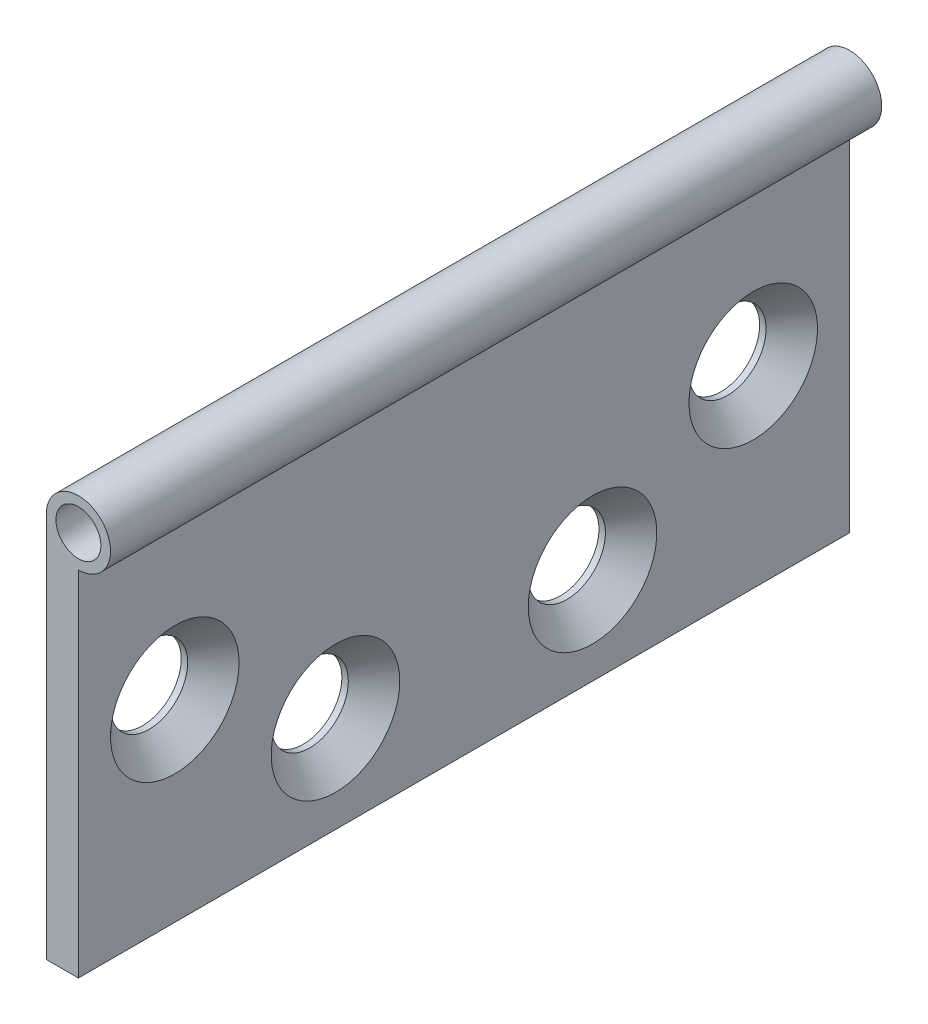
ISO-10303-21;
HEADER;
FILE_DESCRIPTION(('STEP AP214'),'2;1');
FILE_NAME('part.step','',(''),(''),'','','');
FILE_SCHEMA(('AUTOMOTIVE_DESIGN { 1 0 10303 214 1 1 1 1 }'));
ENDSEC;
DATA;
#1=APPLICATION_CONTEXT('core data for automotive mechanical design processes');
#2=APPLICATION_PROTOCOL_DEFINITION('international standard','automotive_design',2000,#1);
#3=PRODUCT_CONTEXT('',#1,'mechanical');
#4=PRODUCT('Part','Part','',(#3));
#5=PRODUCT_RELATED_PRODUCT_CATEGORY('part','',(#4));
#6=PRODUCT_DEFINITION_FORMATION('','',#4);
#7=PRODUCT_DEFINITION_CONTEXT('part definition',#1,'design');
#8=PRODUCT_DEFINITION('design','',#6,#7);
#9=PRODUCT_DEFINITION_SHAPE('','',#8);
#10=(LENGTH_UNIT() NAMED_UNIT(*) SI_UNIT(.MILLI.,.METRE.));
#11=(NAMED_UNIT(*) PLANE_ANGLE_UNIT() SI_UNIT($,.RADIAN.));
#12=(NAMED_UNIT(*) SI_UNIT($,.STERADIAN.) SOLID_ANGLE_UNIT());
#13=UNCERTAINTY_MEASURE_WITH_UNIT(LENGTH_MEASURE(1.E-05),#10,'distance_accuracy_value','');
#14=(GEOMETRIC_REPRESENTATION_CONTEXT(3) GLOBAL_UNCERTAINTY_ASSIGNED_CONTEXT((#13)) GLOBAL_UNIT_ASSIGNED_CONTEXT((#10,
#11,#12)) REPRESENTATION_CONTEXT('',''));
#15=CARTESIAN_POINT('',(0.,0.,0.));
#16=DIRECTION('',(0.,0.,1.));
#17=DIRECTION('',(1.,0.,0.));
#18=AXIS2_PLACEMENT_3D('',#15,#16,#17);
#19=CARTESIAN_POINT('',(5.,0.,60.));
#20=DIRECTION('',(-1.,0.,0.));
#21=DIRECTION('',(0.,0.,1.));
#22=AXIS2_PLACEMENT_3D('',#19,#20,#21);
#23=PLANE('',#22);
#24=CARTESIAN_POINT('',(5.,15.,-20.));
#25=DIRECTION('',(-1.,0.,0.));
#26=DIRECTION('',(0.,0.,1.));
#27=AXIS2_PLACEMENT_3D('',#24,#25,#26);
#28=CIRCLE('',#27,10.);
#29=CARTESIAN_POINT('',(5.,15.,-9.99999999999999));
#30=VERTEX_POINT('',#29);
#31=EDGE_CURVE('E138',#30,#30,#28,.T.);
#32=ORIENTED_EDGE('',*,*,#31,.T.);
#33=EDGE_LOOP('',(#32));
#34=FACE_BOUND('',#33,.T.);
#35=CARTESIAN_POINT('',(5.,30.,-45.));
#36=DIRECTION('',(-1.,0.,0.));
#37=DIRECTION('',(0.,0.,1.));
#38=AXIS2_PLACEMENT_3D('',#35,#36,#37);
#39=CIRCLE('',#38,10.);
#40=CARTESIAN_POINT('',(5.,30.,-35.));
#41=VERTEX_POINT('',#40);
#42=EDGE_CURVE('E142',#41,#41,#39,.T.);
#43=ORIENTED_EDGE('',*,*,#42,.T.);
#44=EDGE_LOOP('',(#43));
#45=FACE_BOUND('',#44,.T.);
#46=CARTESIAN_POINT('',(5.,30.,45.));
#47=DIRECTION('',(1.,0.,0.));
#48=DIRECTION('',(0.,0.,-1.));
#49=AXIS2_PLACEMENT_3D('',#46,#47,#48);
#50=CIRCLE('',#49,10.);
#51=CARTESIAN_POINT('',(5.,30.,35.));
#52=VERTEX_POINT('',#51);
#53=EDGE_CURVE('E146',#52,#52,#50,.T.);
#54=ORIENTED_EDGE('',*,*,#53,.F.);
#55=EDGE_LOOP('',(#54));
#56=FACE_BOUND('',#55,.T.);
#57=CARTESIAN_POINT('',(5.,15.,20.));
#58=DIRECTION('',(1.,0.,0.));
#59=DIRECTION('',(0.,0.,-1.));
#60=AXIS2_PLACEMENT_3D('',#57,#58,#59);
#61=CIRCLE('',#60,10.);
#62=CARTESIAN_POINT('',(5.,15.,9.99999999999999));
#63=VERTEX_POINT('',#62);
#64=EDGE_CURVE('E149',#63,#63,#61,.T.);
#65=ORIENTED_EDGE('',*,*,#64,.F.);
#66=EDGE_LOOP('',(#65));
#67=FACE_BOUND('',#66,.T.);
#68=DIRECTION('',(0.,0.,-1.));
#69=VECTOR('',#68,1.);
#70=CARTESIAN_POINT('',(5.,55.,60.));
#71=LINE('',#70,#69);
#72=CARTESIAN_POINT('',(5.,55.,60.));
#73=VERTEX_POINT('',#72);
#74=CARTESIAN_POINT('',(5.,55.,-60.));
#75=VERTEX_POINT('',#74);
#76=EDGE_CURVE('E62',#73,#75,#71,.T.);
#77=ORIENTED_EDGE('',*,*,#76,.F.);
#78=DIRECTION('',(0.,1.,0.));
#79=VECTOR('',#78,1.);
#80=CARTESIAN_POINT('',(5.,0.,60.));
#81=LINE('',#80,#79);
#82=CARTESIAN_POINT('',(5.,0.,60.));
#83=VERTEX_POINT('',#82);
#84=EDGE_CURVE('E117',#83,#73,#81,.T.);
#85=ORIENTED_EDGE('',*,*,#84,.F.);
#86=DIRECTION('',(0.,0.,-1.));
#87=VECTOR('',#86,1.);
#88=CARTESIAN_POINT('',(5.,0.,60.));
#89=LINE('',#88,#87);
#90=CARTESIAN_POINT('',(5.,0.,-60.));
#91=VERTEX_POINT('',#90);
#92=EDGE_CURVE('E71',#83,#91,#89,.T.);
#93=ORIENTED_EDGE('',*,*,#92,.T.);
#94=DIRECTION('',(0.,1.,0.));
#95=VECTOR('',#94,1.);
#96=CARTESIAN_POINT('',(5.,0.,-60.));
#97=LINE('',#96,#95);
#98=EDGE_CURVE('E112',#91,#75,#97,.T.);
#99=ORIENTED_EDGE('',*,*,#98,.T.);
#100=EDGE_LOOP('',(#77,#85,#93,#99));
#101=FACE_BOUND('',#100,.T.);
#102=ADVANCED_FACE('F48',(#34,#45,#56,#67,#101),#23,.F.);
#103=CARTESIAN_POINT('',(0.,0.,60.));
#104=DIRECTION('',(-1.,0.,0.));
#105=DIRECTION('',(0.,0.,1.));
#106=AXIS2_PLACEMENT_3D('',#103,#104,#105);
#107=PLANE('',#106);
#108=CARTESIAN_POINT('',(0.,15.,-20.));
#109=DIRECTION('',(-1.,0.,0.));
#110=DIRECTION('',(0.,0.,1.));
#111=AXIS2_PLACEMENT_3D('',#108,#109,#110);
#112=CIRCLE('',#111,6.);
#113=CARTESIAN_POINT('',(0.,15.,-14.));
#114=VERTEX_POINT('',#113);
#115=EDGE_CURVE('E229',#114,#114,#112,.T.);
#116=ORIENTED_EDGE('',*,*,#115,.F.);
#117=EDGE_LOOP('',(#116));
#118=FACE_BOUND('',#117,.T.);
#119=CARTESIAN_POINT('',(0.,30.,-45.));
#120=DIRECTION('',(-1.,0.,0.));
#121=DIRECTION('',(0.,0.,1.));
#122=AXIS2_PLACEMENT_3D('',#119,#120,#121);
#123=CIRCLE('',#122,6.);
#124=CARTESIAN_POINT('',(0.,30.,-39.));
#125=VERTEX_POINT('',#124);
#126=EDGE_CURVE('E236',#125,#125,#123,.T.);
#127=ORIENTED_EDGE('',*,*,#126,.F.);
#128=EDGE_LOOP('',(#127));
#129=FACE_BOUND('',#128,.T.);
#130=CARTESIAN_POINT('',(0.,30.,45.));
#131=DIRECTION('',(1.,0.,0.));
#132=DIRECTION('',(0.,0.,-1.));
#133=AXIS2_PLACEMENT_3D('',#130,#131,#132);
#134=CIRCLE('',#133,6.);
#135=CARTESIAN_POINT('',(0.,30.,39.));
#136=VERTEX_POINT('',#135);
#137=EDGE_CURVE('E152',#136,#136,#134,.T.);
#138=ORIENTED_EDGE('',*,*,#137,.T.);
#139=EDGE_LOOP('',(#138));
#140=FACE_BOUND('',#139,.T.);
#141=CARTESIAN_POINT('',(0.,15.,20.));
#142=DIRECTION('',(1.,0.,0.));
#143=DIRECTION('',(0.,0.,-1.));
#144=AXIS2_PLACEMENT_3D('',#141,#142,#143);
#145=CIRCLE('',#144,6.);
#146=CARTESIAN_POINT('',(0.,15.,14.));
#147=VERTEX_POINT('',#146);
#148=EDGE_CURVE('E155',#147,#147,#145,.T.);
#149=ORIENTED_EDGE('',*,*,#148,.T.);
#150=EDGE_LOOP('',(#149));
#151=FACE_BOUND('',#150,.T.);
#152=DIRECTION('',(0.,1.,0.));
#153=VECTOR('',#152,1.);
#154=CARTESIAN_POINT('',(0.,0.,-60.));
#155=LINE('',#154,#153);
#156=CARTESIAN_POINT('',(0.,0.,-60.));
#157=VERTEX_POINT('',#156);
#158=CARTESIAN_POINT('',(0.,60.,-60.));
#159=VERTEX_POINT('',#158);
#160=EDGE_CURVE('E111',#157,#159,#155,.T.);
#161=ORIENTED_EDGE('',*,*,#160,.F.);
#162=DIRECTION('',(0.,0.,-1.));
#163=VECTOR('',#162,1.);
#164=CARTESIAN_POINT('',(0.,0.,60.));
#165=LINE('',#164,#163);
#166=CARTESIAN_POINT('',(0.,0.,60.));
#167=VERTEX_POINT('',#166);
#168=EDGE_CURVE('E55',#167,#157,#165,.T.);
#169=ORIENTED_EDGE('',*,*,#168,.F.);
#170=DIRECTION('',(0.,1.,0.));
#171=VECTOR('',#170,1.);
#172=CARTESIAN_POINT('',(0.,0.,60.));
#173=LINE('',#172,#171);
#174=CARTESIAN_POINT('',(0.,60.,60.));
#175=VERTEX_POINT('',#174);
#176=EDGE_CURVE('E87',#167,#175,#173,.T.);
#177=ORIENTED_EDGE('',*,*,#176,.T.);
#178=DIRECTION('',(0.,0.,-1.));
#179=VECTOR('',#178,1.);
#180=CARTESIAN_POINT('',(0.,60.,60.));
#181=LINE('',#180,#179);
#182=EDGE_CURVE('E13',#175,#159,#181,.T.);
#183=ORIENTED_EDGE('',*,*,#182,.T.);
#184=EDGE_LOOP('',(#161,#169,#177,#183));
#185=FACE_BOUND('',#184,.T.);
#186=ADVANCED_FACE('F128',(#118,#129,#140,#151,#185),#107,.T.);
#187=CARTESIAN_POINT('',(5.,0.,60.));
#188=DIRECTION('',(0.,-1.,0.));
#189=DIRECTION('',(0.,0.,-1.));
#190=AXIS2_PLACEMENT_3D('',#187,#188,#189);
#191=PLANE('',#190);
#192=DIRECTION('',(-1.,0.,0.));
#193=VECTOR('',#192,1.);
#194=CARTESIAN_POINT('',(5.,0.,-60.));
#195=LINE('',#194,#193);
#196=EDGE_CURVE('E119',#91,#157,#195,.T.);
#197=ORIENTED_EDGE('',*,*,#196,.F.);
#198=ORIENTED_EDGE('',*,*,#92,.F.);
#199=DIRECTION('',(-1.,0.,0.));
#200=VECTOR('',#199,1.);
#201=CARTESIAN_POINT('',(5.,0.,60.));
#202=LINE('',#201,#200);
#203=EDGE_CURVE('E121',#83,#167,#202,.T.);
#204=ORIENTED_EDGE('',*,*,#203,.T.);
#205=ORIENTED_EDGE('',*,*,#168,.T.);
#206=EDGE_LOOP('',(#197,#198,#204,#205));
#207=FACE_BOUND('',#206,.T.);
#208=ADVANCED_FACE('F126',(#207),#191,.T.);
#209=CARTESIAN_POINT('',(0.,0.,60.));
#210=DIRECTION('',(0.,0.,-1.));
#211=DIRECTION('',(-1.,0.,0.));
#212=AXIS2_PLACEMENT_3D('',#209,#210,#211);
#213=PLANE('',#212);
#214=CARTESIAN_POINT('',(5.,60.,60.));
#215=DIRECTION('',(0.,0.,1.));
#216=DIRECTION('',(1.,0.,0.));
#217=AXIS2_PLACEMENT_3D('',#214,#215,#216);
#218=CIRCLE('',#217,3.5);
#219=CARTESIAN_POINT('',(8.5,60.,60.));
#220=VERTEX_POINT('',#219);
#221=EDGE_CURVE('E164',#220,#220,#218,.T.);
#222=ORIENTED_EDGE('',*,*,#221,.F.);
#223=EDGE_LOOP('',(#222));
#224=FACE_BOUND('',#223,.T.);
#225=ORIENTED_EDGE('',*,*,#84,.T.);
#226=CARTESIAN_POINT('',(5.,60.,60.));
#227=DIRECTION('',(0.,0.,1.));
#228=DIRECTION('',(1.,0.,0.));
#229=AXIS2_PLACEMENT_3D('',#226,#227,#228);
#230=CIRCLE('',#229,5.);
#231=CARTESIAN_POINT('',(10.,60.,60.));
#232=VERTEX_POINT('',#231);
#233=EDGE_CURVE('E167',#73,#232,#230,.T.);
#234=ORIENTED_EDGE('',*,*,#233,.T.);
#235=EDGE_CURVE('E105',#232,#175,#230,.T.);
#236=ORIENTED_EDGE('',*,*,#235,.T.);
#237=ORIENTED_EDGE('',*,*,#176,.F.);
#238=ORIENTED_EDGE('',*,*,#203,.F.);
#239=EDGE_LOOP('',(#225,#234,#236,#237,#238));
#240=FACE_BOUND('',#239,.T.);
#241=ADVANCED_FACE('F173',(#224,#240),#213,.F.);
#242=CARTESIAN_POINT('',(0.,0.,-60.));
#243=DIRECTION('',(0.,0.,-1.));
#244=DIRECTION('',(-1.,0.,0.));
#245=AXIS2_PLACEMENT_3D('',#242,#243,#244);
#246=PLANE('',#245);
#247=CARTESIAN_POINT('',(5.,60.,-60.));
#248=DIRECTION('',(0.,0.,1.));
#249=DIRECTION('',(1.,0.,0.));
#250=AXIS2_PLACEMENT_3D('',#247,#248,#249);
#251=CIRCLE('',#250,3.5);
#252=CARTESIAN_POINT('',(8.5,60.,-60.));
#253=VERTEX_POINT('',#252);
#254=EDGE_CURVE('E165',#253,#253,#251,.T.);
#255=ORIENTED_EDGE('',*,*,#254,.T.);
#256=EDGE_LOOP('',(#255));
#257=FACE_BOUND('',#256,.T.);
#258=ORIENTED_EDGE('',*,*,#160,.T.);
#259=CARTESIAN_POINT('',(5.,60.,-60.));
#260=DIRECTION('',(0.,0.,1.));
#261=DIRECTION('',(1.,0.,0.));
#262=AXIS2_PLACEMENT_3D('',#259,#260,#261);
#263=CIRCLE('',#262,5.);
#264=CARTESIAN_POINT('',(10.,60.,-60.));
#265=VERTEX_POINT('',#264);
#266=EDGE_CURVE('E102',#265,#159,#263,.T.);
#267=ORIENTED_EDGE('',*,*,#266,.F.);
#268=EDGE_CURVE('E99',#75,#265,#263,.T.);
#269=ORIENTED_EDGE('',*,*,#268,.F.);
#270=ORIENTED_EDGE('',*,*,#98,.F.);
#271=ORIENTED_EDGE('',*,*,#196,.T.);
#272=EDGE_LOOP('',(#258,#267,#269,#270,#271));
#273=FACE_BOUND('',#272,.T.);
#274=ADVANCED_FACE('F108',(#257,#273),#246,.T.);
#275=CARTESIAN_POINT('',(5.,60.,60.));
#276=DIRECTION('',(0.,0.,-1.));
#277=DIRECTION('',(-1.,0.,0.));
#278=AXIS2_PLACEMENT_3D('',#275,#276,#277);
#279=CYLINDRICAL_SURFACE('',#278,5.);
#280=ORIENTED_EDGE('',*,*,#182,.F.);
#281=ORIENTED_EDGE('',*,*,#235,.F.);
#282=ORIENTED_EDGE('',*,*,#233,.F.);
#283=ORIENTED_EDGE('',*,*,#76,.T.);
#284=ORIENTED_EDGE('',*,*,#268,.T.);
#285=ORIENTED_EDGE('',*,*,#266,.T.);
#286=EDGE_LOOP('',(#280,#281,#282,#283,#284,#285));
#287=FACE_BOUND('',#286,.T.);
#288=ADVANCED_FACE('F101',(#287),#279,.T.);
#289=CARTESIAN_POINT('',(5.,60.,-60.));
#290=DIRECTION('',(0.,0.,1.));
#291=DIRECTION('',(1.,0.,0.));
#292=AXIS2_PLACEMENT_3D('',#289,#290,#291);
#293=CYLINDRICAL_SURFACE('',#292,3.5);
#294=ORIENTED_EDGE('',*,*,#254,.F.);
#295=EDGE_LOOP('',(#294));
#296=FACE_BOUND('',#295,.T.);
#297=ORIENTED_EDGE('',*,*,#221,.T.);
#298=EDGE_LOOP('',(#297));
#299=FACE_BOUND('',#298,.T.);
#300=ADVANCED_FACE('F171',(#296,#299),#293,.F.);
#301=CARTESIAN_POINT('',(5.,15.,20.));
#302=DIRECTION('',(1.,0.,0.));
#303=DIRECTION('',(0.,0.,-1.));
#304=AXIS2_PLACEMENT_3D('',#301,#302,#303);
#305=CYLINDRICAL_SURFACE('',#304,6.);
#306=ORIENTED_EDGE('',*,*,#148,.F.);
#307=EDGE_LOOP('',(#306));
#308=FACE_BOUND('',#307,.T.);
#309=CARTESIAN_POINT('',(1.,15.,20.));
#310=DIRECTION('',(1.,0.,0.));
#311=DIRECTION('',(0.,0.,-1.));
#312=AXIS2_PLACEMENT_3D('',#309,#310,#311);
#313=CIRCLE('',#312,6.);
#314=CARTESIAN_POINT('',(1.,15.,14.));
#315=VERTEX_POINT('',#314);
#316=EDGE_CURVE('E151',#315,#315,#313,.T.);
#317=ORIENTED_EDGE('',*,*,#316,.T.);
#318=EDGE_LOOP('',(#317));
#319=FACE_BOUND('',#318,.T.);
#320=ADVANCED_FACE('F191',(#308,#319),#305,.F.);
#321=CARTESIAN_POINT('',(5.,15.,20.));
#322=DIRECTION('',(1.,0.,0.));
#323=DIRECTION('',(0.,0.,-1.));
#324=AXIS2_PLACEMENT_3D('',#321,#322,#323);
#325=CONICAL_SURFACE('',#324,10.,0.785398163397449);
#326=ORIENTED_EDGE('',*,*,#316,.F.);
#327=EDGE_LOOP('',(#326));
#328=FACE_BOUND('',#327,.T.);
#329=ORIENTED_EDGE('',*,*,#64,.T.);
#330=EDGE_LOOP('',(#329));
#331=FACE_BOUND('',#330,.T.);
#332=ADVANCED_FACE('F195',(#328,#331),#325,.F.);
#333=CARTESIAN_POINT('',(5.,30.,45.));
#334=DIRECTION('',(1.,0.,0.));
#335=DIRECTION('',(0.,0.,-1.));
#336=AXIS2_PLACEMENT_3D('',#333,#334,#335);
#337=CYLINDRICAL_SURFACE('',#336,6.);
#338=ORIENTED_EDGE('',*,*,#137,.F.);
#339=EDGE_LOOP('',(#338));
#340=FACE_BOUND('',#339,.T.);
#341=CARTESIAN_POINT('',(1.,30.,45.));
#342=DIRECTION('',(1.,0.,0.));
#343=DIRECTION('',(0.,0.,-1.));
#344=AXIS2_PLACEMENT_3D('',#341,#342,#343);
#345=CIRCLE('',#344,6.);
#346=CARTESIAN_POINT('',(1.,30.,39.));
#347=VERTEX_POINT('',#346);
#348=EDGE_CURVE('E158',#347,#347,#345,.T.);
#349=ORIENTED_EDGE('',*,*,#348,.T.);
#350=EDGE_LOOP('',(#349));
#351=FACE_BOUND('',#350,.T.);
#352=ADVANCED_FACE('F199',(#340,#351),#337,.F.);
#353=CARTESIAN_POINT('',(5.,30.,45.));
#354=DIRECTION('',(1.,0.,0.));
#355=DIRECTION('',(0.,0.,-1.));
#356=AXIS2_PLACEMENT_3D('',#353,#354,#355);
#357=CONICAL_SURFACE('',#356,10.,0.785398163397449);
#358=ORIENTED_EDGE('',*,*,#348,.F.);
#359=EDGE_LOOP('',(#358));
#360=FACE_BOUND('',#359,.T.);
#361=ORIENTED_EDGE('',*,*,#53,.T.);
#362=EDGE_LOOP('',(#361));
#363=FACE_BOUND('',#362,.T.);
#364=ADVANCED_FACE('F203',(#360,#363),#357,.F.);
#365=CARTESIAN_POINT('',(5.,30.,-45.));
#366=DIRECTION('',(1.,0.,0.));
#367=DIRECTION('',(0.,0.,1.));
#368=AXIS2_PLACEMENT_3D('',#365,#366,#367);
#369=CYLINDRICAL_SURFACE('',#368,6.);
#370=ORIENTED_EDGE('',*,*,#126,.T.);
#371=EDGE_LOOP('',(#370));
#372=FACE_BOUND('',#371,.T.);
#373=CARTESIAN_POINT('',(1.,30.,-45.));
#374=DIRECTION('',(-1.,0.,0.));
#375=DIRECTION('',(0.,0.,1.));
#376=AXIS2_PLACEMENT_3D('',#373,#374,#375);
#377=CIRCLE('',#376,6.);
#378=CARTESIAN_POINT('',(1.,30.,-39.));
#379=VERTEX_POINT('',#378);
#380=EDGE_CURVE('E239',#379,#379,#377,.T.);
#381=ORIENTED_EDGE('',*,*,#380,.F.);
#382=EDGE_LOOP('',(#381));
#383=FACE_BOUND('',#382,.T.);
#384=ADVANCED_FACE('F207',(#372,#383),#369,.F.);
#385=CARTESIAN_POINT('',(5.,30.,-45.));
#386=DIRECTION('',(1.,0.,0.));
#387=DIRECTION('',(0.,0.,1.));
#388=AXIS2_PLACEMENT_3D('',#385,#386,#387);
#389=CONICAL_SURFACE('',#388,10.,0.785398163397449);
#390=ORIENTED_EDGE('',*,*,#380,.T.);
#391=EDGE_LOOP('',(#390));
#392=FACE_BOUND('',#391,.T.);
#393=ORIENTED_EDGE('',*,*,#42,.F.);
#394=EDGE_LOOP('',(#393));
#395=FACE_BOUND('',#394,.T.);
#396=ADVANCED_FACE('F211',(#392,#395),#389,.F.);
#397=CARTESIAN_POINT('',(5.,15.,-20.));
#398=DIRECTION('',(1.,0.,0.));
#399=DIRECTION('',(0.,0.,1.));
#400=AXIS2_PLACEMENT_3D('',#397,#398,#399);
#401=CYLINDRICAL_SURFACE('',#400,6.);
#402=ORIENTED_EDGE('',*,*,#115,.T.);
#403=EDGE_LOOP('',(#402));
#404=FACE_BOUND('',#403,.T.);
#405=CARTESIAN_POINT('',(1.,15.,-20.));
#406=DIRECTION('',(-1.,0.,0.));
#407=DIRECTION('',(0.,0.,1.));
#408=AXIS2_PLACEMENT_3D('',#405,#406,#407);
#409=CIRCLE('',#408,6.);
#410=CARTESIAN_POINT('',(1.,15.,-14.));
#411=VERTEX_POINT('',#410);
#412=EDGE_CURVE('E228',#411,#411,#409,.T.);
#413=ORIENTED_EDGE('',*,*,#412,.F.);
#414=EDGE_LOOP('',(#413));
#415=FACE_BOUND('',#414,.T.);
#416=ADVANCED_FACE('F215',(#404,#415),#401,.F.);
#417=CARTESIAN_POINT('',(5.,15.,-20.));
#418=DIRECTION('',(1.,0.,0.));
#419=DIRECTION('',(0.,0.,1.));
#420=AXIS2_PLACEMENT_3D('',#417,#418,#419);
#421=CONICAL_SURFACE('',#420,10.,0.785398163397449);
#422=ORIENTED_EDGE('',*,*,#412,.T.);
#423=EDGE_LOOP('',(#422));
#424=FACE_BOUND('',#423,.T.);
#425=ORIENTED_EDGE('',*,*,#31,.F.);
#426=EDGE_LOOP('',(#425));
#427=FACE_BOUND('',#426,.T.);
#428=ADVANCED_FACE('F219',(#424,#427),#421,.F.);
#429=CLOSED_SHELL('',(#102,#186,#208,#241,#274,#288,#300,#320,#332,#352,#364,#384,#396,#416,#428));
#430=MANIFOLD_SOLID_BREP('B2',#429);
#431=ADVANCED_BREP_SHAPE_REPRESENTATION('',(#18,#430),#14);
#432=SHAPE_DEFINITION_REPRESENTATION(#9,#431);
ENDSEC;
END-ISO-10303-21;
